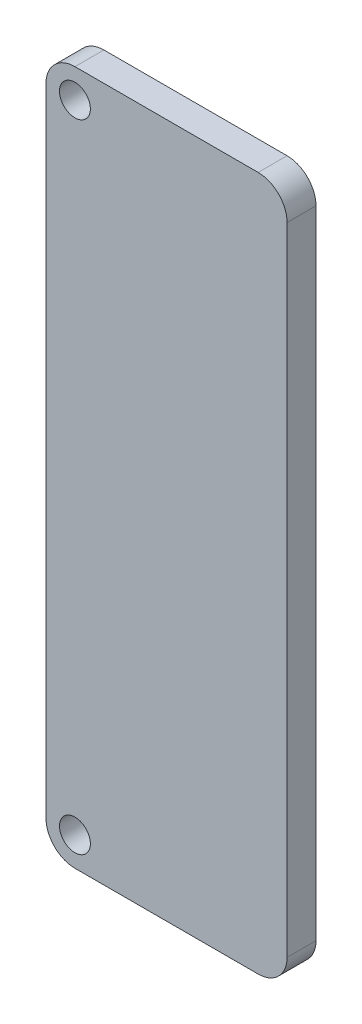
ISO-10303-21;
HEADER;
FILE_DESCRIPTION(('STEP AP214'),'2;1');
FILE_NAME('part.step','',(''),(''),'','','');
FILE_SCHEMA(('AUTOMOTIVE_DESIGN { 1 0 10303 214 1 1 1 1 }'));
ENDSEC;
DATA;
#1=APPLICATION_CONTEXT('core data for automotive mechanical design processes');
#2=APPLICATION_PROTOCOL_DEFINITION('international standard','automotive_design',2000,#1);
#3=PRODUCT_CONTEXT('',#1,'mechanical');
#4=PRODUCT('Part','Part','',(#3));
#5=PRODUCT_RELATED_PRODUCT_CATEGORY('part','',(#4));
#6=PRODUCT_DEFINITION_FORMATION('','',#4);
#7=PRODUCT_DEFINITION_CONTEXT('part definition',#1,'design');
#8=PRODUCT_DEFINITION('design','',#6,#7);
#9=PRODUCT_DEFINITION_SHAPE('','',#8);
#10=(LENGTH_UNIT() NAMED_UNIT(*) SI_UNIT(.MILLI.,.METRE.));
#11=(NAMED_UNIT(*) PLANE_ANGLE_UNIT() SI_UNIT($,.RADIAN.));
#12=(NAMED_UNIT(*) SI_UNIT($,.STERADIAN.) SOLID_ANGLE_UNIT());
#13=UNCERTAINTY_MEASURE_WITH_UNIT(LENGTH_MEASURE(1.E-05),#10,'distance_accuracy_value','');
#14=(GEOMETRIC_REPRESENTATION_CONTEXT(3) GLOBAL_UNCERTAINTY_ASSIGNED_CONTEXT((#13)) GLOBAL_UNIT_ASSIGNED_CONTEXT((#10,
#11,#12)) REPRESENTATION_CONTEXT('',''));
#15=CARTESIAN_POINT('',(0.,0.,0.));
#16=DIRECTION('',(0.,0.,1.));
#17=DIRECTION('',(1.,0.,0.));
#18=AXIS2_PLACEMENT_3D('',#15,#16,#17);
#19=CARTESIAN_POINT('',(-22.,-33.,3.));
#20=DIRECTION('',(0.,0.,1.));
#21=DIRECTION('',(1.,0.,0.));
#22=AXIS2_PLACEMENT_3D('',#19,#20,#21);
#23=PLANE('',#22);
#24=CARTESIAN_POINT('',(-22.,33.,3.));
#25=DIRECTION('',(0.,0.,1.));
#26=DIRECTION('',(1.,0.,0.));
#27=AXIS2_PLACEMENT_3D('',#24,#25,#26);
#28=CIRCLE('',#27,1.6);
#29=CARTESIAN_POINT('',(-20.4,33.,3.));
#30=VERTEX_POINT('',#29);
#31=EDGE_CURVE('E207',#30,#30,#28,.T.);
#32=ORIENTED_EDGE('',*,*,#31,.F.);
#33=EDGE_LOOP('',(#32));
#34=FACE_BOUND('',#33,.T.);
#35=DIRECTION('',(0.,1.,0.));
#36=VECTOR('',#35,1.);
#37=CARTESIAN_POINT('',(0.,36.,3.));
#38=LINE('',#37,#36);
#39=CARTESIAN_POINT('',(0.,-33.,3.));
#40=VERTEX_POINT('',#39);
#41=CARTESIAN_POINT('',(0.,33.,3.));
#42=VERTEX_POINT('',#41);
#43=EDGE_CURVE('E116',#40,#42,#38,.T.);
#44=ORIENTED_EDGE('',*,*,#43,.T.);
#45=CARTESIAN_POINT('',(-3.,33.,3.));
#46=DIRECTION('',(0.,0.,1.));
#47=DIRECTION('',(1.,0.,0.));
#48=AXIS2_PLACEMENT_3D('',#45,#46,#47);
#49=CIRCLE('',#48,3.);
#50=CARTESIAN_POINT('',(-3.,36.,3.));
#51=VERTEX_POINT('',#50);
#52=EDGE_CURVE('E51',#42,#51,#49,.T.);
#53=ORIENTED_EDGE('',*,*,#52,.T.);
#54=DIRECTION('',(-1.,0.,0.));
#55=VECTOR('',#54,1.);
#56=CARTESIAN_POINT('',(0.,36.,3.));
#57=LINE('',#56,#55);
#58=CARTESIAN_POINT('',(-22.,36.,3.));
#59=VERTEX_POINT('',#58);
#60=EDGE_CURVE('E162',#51,#59,#57,.T.);
#61=ORIENTED_EDGE('',*,*,#60,.T.);
#62=CARTESIAN_POINT('',(-22.,33.,3.));
#63=DIRECTION('',(0.,0.,1.));
#64=DIRECTION('',(-1.,0.,0.));
#65=AXIS2_PLACEMENT_3D('',#62,#63,#64);
#66=CIRCLE('',#65,3.);
#67=CARTESIAN_POINT('',(-25.,33.,3.));
#68=VERTEX_POINT('',#67);
#69=EDGE_CURVE('E171',#59,#68,#66,.T.);
#70=ORIENTED_EDGE('',*,*,#69,.T.);
#71=DIRECTION('',(0.,-1.,0.));
#72=VECTOR('',#71,1.);
#73=CARTESIAN_POINT('',(-25.,-33.,3.));
#74=LINE('',#73,#72);
#75=CARTESIAN_POINT('',(-25.,-33.,3.));
#76=VERTEX_POINT('',#75);
#77=EDGE_CURVE('E122',#68,#76,#74,.T.);
#78=ORIENTED_EDGE('',*,*,#77,.T.);
#79=CARTESIAN_POINT('',(-22.,-33.,3.));
#80=DIRECTION('',(0.,0.,1.));
#81=DIRECTION('',(1.,0.,0.));
#82=AXIS2_PLACEMENT_3D('',#79,#80,#81);
#83=CIRCLE('',#82,3.);
#84=CARTESIAN_POINT('',(-22.,-36.,3.));
#85=VERTEX_POINT('',#84);
#86=EDGE_CURVE('E117',#76,#85,#83,.T.);
#87=ORIENTED_EDGE('',*,*,#86,.T.);
#88=DIRECTION('',(1.,0.,0.));
#89=VECTOR('',#88,1.);
#90=CARTESIAN_POINT('',(0.,-36.,3.));
#91=LINE('',#90,#89);
#92=CARTESIAN_POINT('',(-2.99999999999999,-36.,3.));
#93=VERTEX_POINT('',#92);
#94=EDGE_CURVE('E107',#85,#93,#91,.T.);
#95=ORIENTED_EDGE('',*,*,#94,.T.);
#96=CARTESIAN_POINT('',(-2.99999999999999,-33.,3.));
#97=DIRECTION('',(0.,0.,1.));
#98=DIRECTION('',(1.,0.,0.));
#99=AXIS2_PLACEMENT_3D('',#96,#97,#98);
#100=CIRCLE('',#99,3.);
#101=EDGE_CURVE('E157',#93,#40,#100,.T.);
#102=ORIENTED_EDGE('',*,*,#101,.T.);
#103=EDGE_LOOP('',(#44,#53,#61,#70,#78,#87,#95,#102));
#104=FACE_BOUND('',#103,.T.);
#105=CARTESIAN_POINT('',(-22.,-33.,3.));
#106=DIRECTION('',(0.,0.,1.));
#107=DIRECTION('',(1.,0.,0.));
#108=AXIS2_PLACEMENT_3D('',#105,#106,#107);
#109=CIRCLE('',#108,1.6);
#110=CARTESIAN_POINT('',(-20.4,-33.,3.));
#111=VERTEX_POINT('',#110);
#112=EDGE_CURVE('E221',#111,#111,#109,.T.);
#113=ORIENTED_EDGE('',*,*,#112,.F.);
#114=EDGE_LOOP('',(#113));
#115=FACE_BOUND('',#114,.T.);
#116=ADVANCED_FACE('F42',(#34,#104,#115),#23,.T.);
#117=CARTESIAN_POINT('',(-22.,-33.,0.));
#118=DIRECTION('',(0.,0.,1.));
#119=DIRECTION('',(1.,0.,0.));
#120=AXIS2_PLACEMENT_3D('',#117,#118,#119);
#121=PLANE('',#120);
#122=DIRECTION('',(-1.,0.,0.));
#123=VECTOR('',#122,1.);
#124=CARTESIAN_POINT('',(0.,36.,0.));
#125=LINE('',#124,#123);
#126=CARTESIAN_POINT('',(-3.,36.,0.));
#127=VERTEX_POINT('',#126);
#128=CARTESIAN_POINT('',(-22.,36.,0.));
#129=VERTEX_POINT('',#128);
#130=EDGE_CURVE('E180',#127,#129,#125,.T.);
#131=ORIENTED_EDGE('',*,*,#130,.F.);
#132=CARTESIAN_POINT('',(-3.,33.,0.));
#133=DIRECTION('',(0.,0.,1.));
#134=DIRECTION('',(1.,0.,0.));
#135=AXIS2_PLACEMENT_3D('',#132,#133,#134);
#136=CIRCLE('',#135,3.);
#137=CARTESIAN_POINT('',(0.,33.,0.));
#138=VERTEX_POINT('',#137);
#139=EDGE_CURVE('E148',#127,#138,#136,.F.);
#140=ORIENTED_EDGE('',*,*,#139,.T.);
#141=DIRECTION('',(0.,1.,0.));
#142=VECTOR('',#141,1.);
#143=CARTESIAN_POINT('',(0.,36.,0.));
#144=LINE('',#143,#142);
#145=CARTESIAN_POINT('',(0.,-33.,0.));
#146=VERTEX_POINT('',#145);
#147=EDGE_CURVE('E178',#146,#138,#144,.T.);
#148=ORIENTED_EDGE('',*,*,#147,.F.);
#149=CARTESIAN_POINT('',(-2.99999999999999,-33.,0.));
#150=DIRECTION('',(0.,0.,1.));
#151=DIRECTION('',(1.,0.,0.));
#152=AXIS2_PLACEMENT_3D('',#149,#150,#151);
#153=CIRCLE('',#152,3.);
#154=CARTESIAN_POINT('',(-2.99999999999999,-36.,0.));
#155=VERTEX_POINT('',#154);
#156=EDGE_CURVE('E139',#146,#155,#153,.F.);
#157=ORIENTED_EDGE('',*,*,#156,.T.);
#158=DIRECTION('',(1.,0.,0.));
#159=VECTOR('',#158,1.);
#160=CARTESIAN_POINT('',(0.,-36.,0.));
#161=LINE('',#160,#159);
#162=CARTESIAN_POINT('',(-22.,-36.,0.));
#163=VERTEX_POINT('',#162);
#164=EDGE_CURVE('E184',#163,#155,#161,.T.);
#165=ORIENTED_EDGE('',*,*,#164,.F.);
#166=CARTESIAN_POINT('',(-22.,-33.,0.));
#167=DIRECTION('',(0.,0.,1.));
#168=DIRECTION('',(1.,0.,0.));
#169=AXIS2_PLACEMENT_3D('',#166,#167,#168);
#170=CIRCLE('',#169,3.);
#171=CARTESIAN_POINT('',(-25.,-33.,0.));
#172=VERTEX_POINT('',#171);
#173=EDGE_CURVE('E131',#172,#163,#170,.T.);
#174=ORIENTED_EDGE('',*,*,#173,.F.);
#175=DIRECTION('',(0.,-1.,0.));
#176=VECTOR('',#175,1.);
#177=CARTESIAN_POINT('',(-25.,-33.,0.));
#178=LINE('',#177,#176);
#179=CARTESIAN_POINT('',(-25.,33.,0.));
#180=VERTEX_POINT('',#179);
#181=EDGE_CURVE('E127',#180,#172,#178,.T.);
#182=ORIENTED_EDGE('',*,*,#181,.F.);
#183=CARTESIAN_POINT('',(-22.,33.,0.));
#184=DIRECTION('',(0.,0.,1.));
#185=DIRECTION('',(-1.,0.,0.));
#186=AXIS2_PLACEMENT_3D('',#183,#184,#185);
#187=CIRCLE('',#186,3.);
#188=EDGE_CURVE('E188',#129,#180,#187,.T.);
#189=ORIENTED_EDGE('',*,*,#188,.F.);
#190=EDGE_LOOP('',(#131,#140,#148,#157,#165,#174,#182,#189));
#191=FACE_BOUND('',#190,.T.);
#192=CARTESIAN_POINT('',(-22.,33.,0.));
#193=DIRECTION('',(0.,0.,1.));
#194=DIRECTION('',(1.,0.,0.));
#195=AXIS2_PLACEMENT_3D('',#192,#193,#194);
#196=CIRCLE('',#195,1.6);
#197=CARTESIAN_POINT('',(-20.4,33.,0.));
#198=VERTEX_POINT('',#197);
#199=EDGE_CURVE('E210',#198,#198,#196,.T.);
#200=ORIENTED_EDGE('',*,*,#199,.T.);
#201=EDGE_LOOP('',(#200));
#202=FACE_BOUND('',#201,.T.);
#203=CARTESIAN_POINT('',(-22.,-33.,0.));
#204=DIRECTION('',(0.,0.,1.));
#205=DIRECTION('',(1.,0.,0.));
#206=AXIS2_PLACEMENT_3D('',#203,#204,#205);
#207=CIRCLE('',#206,1.6);
#208=CARTESIAN_POINT('',(-20.4,-33.,0.));
#209=VERTEX_POINT('',#208);
#210=EDGE_CURVE('E223',#209,#209,#207,.T.);
#211=ORIENTED_EDGE('',*,*,#210,.T.);
#212=EDGE_LOOP('',(#211));
#213=FACE_BOUND('',#212,.T.);
#214=ADVANCED_FACE('F176',(#191,#202,#213),#121,.F.);
#215=CARTESIAN_POINT('',(-22.,-33.,3.));
#216=DIRECTION('',(0.,0.,-1.));
#217=DIRECTION('',(-1.,0.,0.));
#218=AXIS2_PLACEMENT_3D('',#215,#216,#217);
#219=CYLINDRICAL_SURFACE('',#218,3.);
#220=ORIENTED_EDGE('',*,*,#173,.T.);
#221=DIRECTION('',(0.,0.,-1.));
#222=VECTOR('',#221,1.);
#223=CARTESIAN_POINT('',(-22.,-36.,3.));
#224=LINE('',#223,#222);
#225=EDGE_CURVE('E111',#85,#163,#224,.T.);
#226=ORIENTED_EDGE('',*,*,#225,.F.);
#227=ORIENTED_EDGE('',*,*,#86,.F.);
#228=DIRECTION('',(0.,0.,-1.));
#229=VECTOR('',#228,1.);
#230=CARTESIAN_POINT('',(-25.,-33.,3.));
#231=LINE('',#230,#229);
#232=EDGE_CURVE('E197',#76,#172,#231,.T.);
#233=ORIENTED_EDGE('',*,*,#232,.T.);
#234=EDGE_LOOP('',(#220,#226,#227,#233));
#235=FACE_BOUND('',#234,.T.);
#236=ADVANCED_FACE('F129',(#235),#219,.T.);
#237=CARTESIAN_POINT('',(0.,-36.,3.));
#238=DIRECTION('',(0.,1.,0.));
#239=DIRECTION('',(-1.,0.,0.));
#240=AXIS2_PLACEMENT_3D('',#237,#238,#239);
#241=PLANE('',#240);
#242=ORIENTED_EDGE('',*,*,#164,.T.);
#243=DIRECTION('',(0.,0.,-1.));
#244=VECTOR('',#243,1.);
#245=CARTESIAN_POINT('',(-2.99999999999999,-36.,3.));
#246=LINE('',#245,#244);
#247=EDGE_CURVE('E11',#155,#93,#246,.F.);
#248=ORIENTED_EDGE('',*,*,#247,.T.);
#249=ORIENTED_EDGE('',*,*,#94,.F.);
#250=ORIENTED_EDGE('',*,*,#225,.T.);
#251=EDGE_LOOP('',(#242,#248,#249,#250));
#252=FACE_BOUND('',#251,.T.);
#253=ADVANCED_FACE('F109',(#252),#241,.F.);
#254=CARTESIAN_POINT('',(0.,36.,3.));
#255=DIRECTION('',(-1.,0.,0.));
#256=DIRECTION('',(0.,-1.,0.));
#257=AXIS2_PLACEMENT_3D('',#254,#255,#256);
#258=PLANE('',#257);
#259=ORIENTED_EDGE('',*,*,#147,.T.);
#260=DIRECTION('',(0.,0.,-1.));
#261=VECTOR('',#260,1.);
#262=CARTESIAN_POINT('',(0.,33.,3.));
#263=LINE('',#262,#261);
#264=EDGE_CURVE('E64',#138,#42,#263,.F.);
#265=ORIENTED_EDGE('',*,*,#264,.T.);
#266=ORIENTED_EDGE('',*,*,#43,.F.);
#267=DIRECTION('',(0.,0.,-1.));
#268=VECTOR('',#267,1.);
#269=CARTESIAN_POINT('',(0.,-33.,3.));
#270=LINE('',#269,#268);
#271=EDGE_CURVE('E151',#40,#146,#270,.T.);
#272=ORIENTED_EDGE('',*,*,#271,.T.);
#273=EDGE_LOOP('',(#259,#265,#266,#272));
#274=FACE_BOUND('',#273,.T.);
#275=ADVANCED_FACE('F181',(#274),#258,.F.);
#276=CARTESIAN_POINT('',(0.,36.,3.));
#277=DIRECTION('',(0.,-1.,0.));
#278=DIRECTION('',(0.,0.,-1.));
#279=AXIS2_PLACEMENT_3D('',#276,#277,#278);
#280=PLANE('',#279);
#281=ORIENTED_EDGE('',*,*,#60,.F.);
#282=DIRECTION('',(0.,0.,-1.));
#283=VECTOR('',#282,1.);
#284=CARTESIAN_POINT('',(-3.,36.,3.));
#285=LINE('',#284,#283);
#286=EDGE_CURVE('E133',#51,#127,#285,.T.);
#287=ORIENTED_EDGE('',*,*,#286,.T.);
#288=ORIENTED_EDGE('',*,*,#130,.T.);
#289=DIRECTION('',(0.,0.,-1.));
#290=VECTOR('',#289,1.);
#291=CARTESIAN_POINT('',(-22.,36.,3.));
#292=LINE('',#291,#290);
#293=EDGE_CURVE('E134',#59,#129,#292,.T.);
#294=ORIENTED_EDGE('',*,*,#293,.F.);
#295=EDGE_LOOP('',(#281,#287,#288,#294));
#296=FACE_BOUND('',#295,.T.);
#297=ADVANCED_FACE('F167',(#296),#280,.F.);
#298=CARTESIAN_POINT('',(-22.,33.,3.));
#299=DIRECTION('',(0.,0.,-1.));
#300=DIRECTION('',(-1.,0.,0.));
#301=AXIS2_PLACEMENT_3D('',#298,#299,#300);
#302=CYLINDRICAL_SURFACE('',#301,3.);
#303=ORIENTED_EDGE('',*,*,#188,.T.);
#304=DIRECTION('',(0.,0.,-1.));
#305=VECTOR('',#304,1.);
#306=CARTESIAN_POINT('',(-25.,33.,3.));
#307=LINE('',#306,#305);
#308=EDGE_CURVE('E142',#68,#180,#307,.T.);
#309=ORIENTED_EDGE('',*,*,#308,.F.);
#310=ORIENTED_EDGE('',*,*,#69,.F.);
#311=ORIENTED_EDGE('',*,*,#293,.T.);
#312=EDGE_LOOP('',(#303,#309,#310,#311));
#313=FACE_BOUND('',#312,.T.);
#314=ADVANCED_FACE('F248',(#313),#302,.T.);
#315=CARTESIAN_POINT('',(-25.,-33.,3.));
#316=DIRECTION('',(1.,0.,0.));
#317=DIRECTION('',(0.,1.,0.));
#318=AXIS2_PLACEMENT_3D('',#315,#316,#317);
#319=PLANE('',#318);
#320=ORIENTED_EDGE('',*,*,#181,.T.);
#321=ORIENTED_EDGE('',*,*,#232,.F.);
#322=ORIENTED_EDGE('',*,*,#77,.F.);
#323=ORIENTED_EDGE('',*,*,#308,.T.);
#324=EDGE_LOOP('',(#320,#321,#322,#323));
#325=FACE_BOUND('',#324,.T.);
#326=ADVANCED_FACE('F204',(#325),#319,.F.);
#327=CARTESIAN_POINT('',(-22.,33.,3.));
#328=DIRECTION('',(0.,0.,-1.));
#329=DIRECTION('',(-1.,0.,0.));
#330=AXIS2_PLACEMENT_3D('',#327,#328,#329);
#331=CYLINDRICAL_SURFACE('',#330,1.6);
#332=ORIENTED_EDGE('',*,*,#31,.T.);
#333=EDGE_LOOP('',(#332));
#334=FACE_BOUND('',#333,.T.);
#335=ORIENTED_EDGE('',*,*,#199,.F.);
#336=EDGE_LOOP('',(#335));
#337=FACE_BOUND('',#336,.T.);
#338=ADVANCED_FACE('F243',(#334,#337),#331,.F.);
#339=CARTESIAN_POINT('',(-22.,-33.,3.));
#340=DIRECTION('',(0.,0.,-1.));
#341=DIRECTION('',(-1.,0.,0.));
#342=AXIS2_PLACEMENT_3D('',#339,#340,#341);
#343=CYLINDRICAL_SURFACE('',#342,1.6);
#344=ORIENTED_EDGE('',*,*,#112,.T.);
#345=EDGE_LOOP('',(#344));
#346=FACE_BOUND('',#345,.T.);
#347=ORIENTED_EDGE('',*,*,#210,.F.);
#348=EDGE_LOOP('',(#347));
#349=FACE_BOUND('',#348,.T.);
#350=ADVANCED_FACE('F231',(#346,#349),#343,.F.);
#351=CARTESIAN_POINT('',(-3.,33.,3.));
#352=DIRECTION('',(0.,0.,-1.));
#353=DIRECTION('',(-1.,0.,0.));
#354=AXIS2_PLACEMENT_3D('',#351,#352,#353);
#355=CYLINDRICAL_SURFACE('',#354,3.);
#356=ORIENTED_EDGE('',*,*,#52,.F.);
#357=ORIENTED_EDGE('',*,*,#264,.F.);
#358=ORIENTED_EDGE('',*,*,#139,.F.);
#359=ORIENTED_EDGE('',*,*,#286,.F.);
#360=EDGE_LOOP('',(#356,#357,#358,#359));
#361=FACE_BOUND('',#360,.T.);
#362=ADVANCED_FACE('F173',(#361),#355,.T.);
#363=CARTESIAN_POINT('',(-2.99999999999999,-33.,3.));
#364=DIRECTION('',(0.,0.,-1.));
#365=DIRECTION('',(-1.,0.,0.));
#366=AXIS2_PLACEMENT_3D('',#363,#364,#365);
#367=CYLINDRICAL_SURFACE('',#366,3.);
#368=ORIENTED_EDGE('',*,*,#101,.F.);
#369=ORIENTED_EDGE('',*,*,#247,.F.);
#370=ORIENTED_EDGE('',*,*,#156,.F.);
#371=ORIENTED_EDGE('',*,*,#271,.F.);
#372=EDGE_LOOP('',(#368,#369,#370,#371));
#373=FACE_BOUND('',#372,.T.);
#374=ADVANCED_FACE('F44',(#373),#367,.T.);
#375=CLOSED_SHELL('',(#116,#214,#236,#253,#275,#297,#314,#326,#338,#350,#362,#374));
#376=MANIFOLD_SOLID_BREP('B2',#375);
#377=ADVANCED_BREP_SHAPE_REPRESENTATION('',(#18,#376),#14);
#378=SHAPE_DEFINITION_REPRESENTATION(#9,#377);
ENDSEC;
END-ISO-10303-21;
